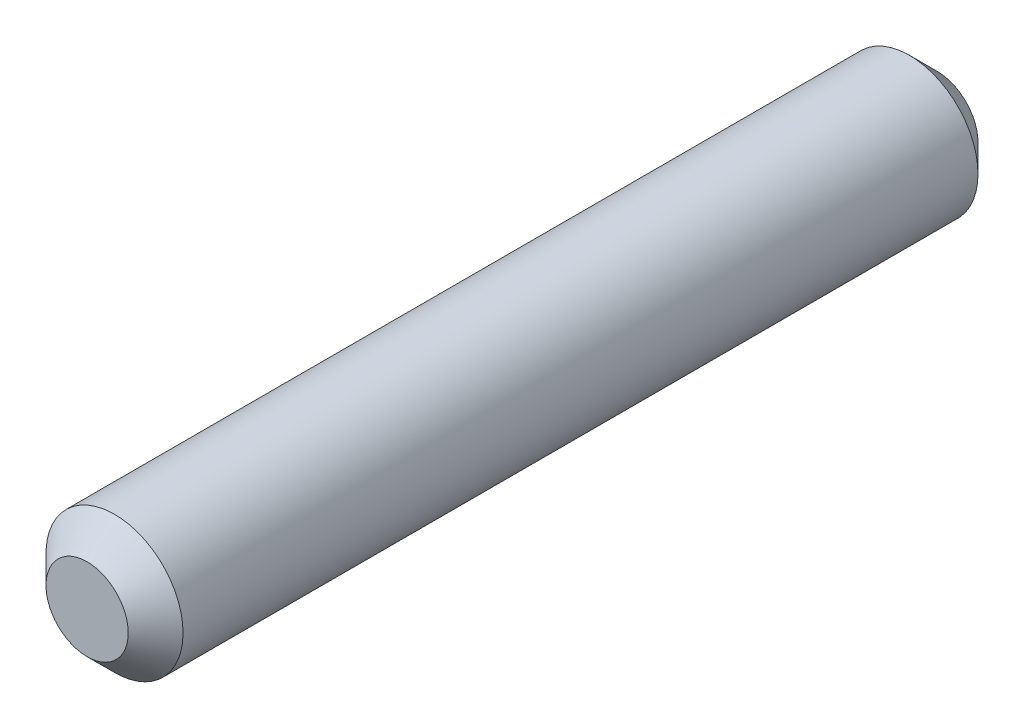
ISO-10303-21;
HEADER;
FILE_DESCRIPTION(('STEP AP214'),'2;1');
FILE_NAME('part.step','',(''),(''),'','','');
FILE_SCHEMA(('AUTOMOTIVE_DESIGN { 1 0 10303 214 1 1 1 1 }'));
ENDSEC;
DATA;
#1=APPLICATION_CONTEXT('core data for automotive mechanical design processes');
#2=APPLICATION_PROTOCOL_DEFINITION('international standard','automotive_design',2000,#1);
#3=PRODUCT_CONTEXT('',#1,'mechanical');
#4=PRODUCT('Part','Part','',(#3));
#5=PRODUCT_RELATED_PRODUCT_CATEGORY('part','',(#4));
#6=PRODUCT_DEFINITION_FORMATION('','',#4);
#7=PRODUCT_DEFINITION_CONTEXT('part definition',#1,'design');
#8=PRODUCT_DEFINITION('design','',#6,#7);
#9=PRODUCT_DEFINITION_SHAPE('','',#8);
#10=(LENGTH_UNIT() NAMED_UNIT(*) SI_UNIT(.MILLI.,.METRE.));
#11=(NAMED_UNIT(*) PLANE_ANGLE_UNIT() SI_UNIT($,.RADIAN.));
#12=(NAMED_UNIT(*) SI_UNIT($,.STERADIAN.) SOLID_ANGLE_UNIT());
#13=UNCERTAINTY_MEASURE_WITH_UNIT(LENGTH_MEASURE(1.E-05),#10,'distance_accuracy_value','');
#14=(GEOMETRIC_REPRESENTATION_CONTEXT(3) GLOBAL_UNCERTAINTY_ASSIGNED_CONTEXT((#13)) GLOBAL_UNIT_ASSIGNED_CONTEXT((#10,
#11,#12)) REPRESENTATION_CONTEXT('',''));
#15=CARTESIAN_POINT('',(0.,0.,0.));
#16=DIRECTION('',(0.,0.,1.));
#17=DIRECTION('',(1.,0.,0.));
#18=AXIS2_PLACEMENT_3D('',#15,#16,#17);
#19=CARTESIAN_POINT('',(0.,0.,31.));
#20=DIRECTION('',(0.,0.,-1.));
#21=DIRECTION('',(-1.,0.,0.));
#22=AXIS2_PLACEMENT_3D('',#19,#20,#21);
#23=CYLINDRICAL_SURFACE('',#22,5.);
#24=CARTESIAN_POINT('',(0.,0.,-29.));
#25=DIRECTION('',(0.,0.,1.));
#26=DIRECTION('',(1.,0.,0.));
#27=AXIS2_PLACEMENT_3D('',#24,#25,#26);
#28=CIRCLE('',#27,5.);
#29=CARTESIAN_POINT('',(5.,0.,-29.));
#30=VERTEX_POINT('',#29);
#31=EDGE_CURVE('E43',#30,#30,#28,.T.);
#32=ORIENTED_EDGE('',*,*,#31,.T.);
#33=EDGE_LOOP('',(#32));
#34=FACE_BOUND('',#33,.T.);
#35=CARTESIAN_POINT('',(0.,0.,29.));
#36=DIRECTION('',(0.,0.,1.));
#37=DIRECTION('',(1.,0.,0.));
#38=AXIS2_PLACEMENT_3D('',#35,#36,#37);
#39=CIRCLE('',#38,5.);
#40=CARTESIAN_POINT('',(5.,0.,29.));
#41=VERTEX_POINT('',#40);
#42=EDGE_CURVE('E47',#41,#41,#39,.F.);
#43=ORIENTED_EDGE('',*,*,#42,.T.);
#44=EDGE_LOOP('',(#43));
#45=FACE_BOUND('',#44,.T.);
#46=ADVANCED_FACE('F32',(#34,#45),#23,.T.);
#47=CARTESIAN_POINT('',(0.,0.,31.));
#48=DIRECTION('',(0.,0.,1.));
#49=DIRECTION('',(1.,0.,0.));
#50=AXIS2_PLACEMENT_3D('',#47,#48,#49);
#51=PLANE('',#50);
#52=CARTESIAN_POINT('',(0.,0.,31.));
#53=DIRECTION('',(0.,0.,1.));
#54=DIRECTION('',(1.,0.,0.));
#55=AXIS2_PLACEMENT_3D('',#52,#53,#54);
#56=CIRCLE('',#55,3.00000000000001);
#57=CARTESIAN_POINT('',(3.00000000000001,0.,31.));
#58=VERTEX_POINT('',#57);
#59=EDGE_CURVE('E10',#58,#58,#56,.T.);
#60=ORIENTED_EDGE('',*,*,#59,.T.);
#61=EDGE_LOOP('',(#60));
#62=FACE_BOUND('',#61,.T.);
#63=ADVANCED_FACE('F63',(#62),#51,.T.);
#64=CARTESIAN_POINT('',(0.,0.,-31.));
#65=DIRECTION('',(0.,0.,1.));
#66=DIRECTION('',(1.,0.,0.));
#67=AXIS2_PLACEMENT_3D('',#64,#65,#66);
#68=PLANE('',#67);
#69=CARTESIAN_POINT('',(0.,0.,-31.));
#70=DIRECTION('',(0.,0.,1.));
#71=DIRECTION('',(1.,0.,0.));
#72=AXIS2_PLACEMENT_3D('',#69,#70,#71);
#73=CIRCLE('',#72,2.99999999999998);
#74=CARTESIAN_POINT('',(2.99999999999998,0.,-31.));
#75=VERTEX_POINT('',#74);
#76=EDGE_CURVE('E39',#75,#75,#73,.F.);
#77=ORIENTED_EDGE('',*,*,#76,.T.);
#78=EDGE_LOOP('',(#77));
#79=FACE_BOUND('',#78,.T.);
#80=ADVANCED_FACE('F60',(#79),#68,.F.);
#81=CARTESIAN_POINT('',(0.,0.,-29.));
#82=DIRECTION('',(0.,0.,1.));
#83=DIRECTION('',(1.,0.,0.));
#84=AXIS2_PLACEMENT_3D('',#81,#82,#83);
#85=CONICAL_SURFACE('',#84,5.,0.785398163397451);
#86=ORIENTED_EDGE('',*,*,#76,.F.);
#87=EDGE_LOOP('',(#86));
#88=FACE_BOUND('',#87,.T.);
#89=ORIENTED_EDGE('',*,*,#31,.F.);
#90=EDGE_LOOP('',(#89));
#91=FACE_BOUND('',#90,.T.);
#92=ADVANCED_FACE('F56',(#88,#91),#85,.T.);
#93=CARTESIAN_POINT('',(0.,0.,31.));
#94=DIRECTION('',(0.,0.,-1.));
#95=DIRECTION('',(-1.,0.,0.));
#96=AXIS2_PLACEMENT_3D('',#93,#94,#95);
#97=CONICAL_SURFACE('',#96,3.00000000000001,0.785398163397444);
#98=ORIENTED_EDGE('',*,*,#42,.F.);
#99=EDGE_LOOP('',(#98));
#100=FACE_BOUND('',#99,.T.);
#101=ORIENTED_EDGE('',*,*,#59,.F.);
#102=EDGE_LOOP('',(#101));
#103=FACE_BOUND('',#102,.T.);
#104=ADVANCED_FACE('F34',(#100,#103),#97,.T.);
#105=CLOSED_SHELL('',(#46,#63,#80,#92,#104));
#106=MANIFOLD_SOLID_BREP('B2',#105);
#107=ADVANCED_BREP_SHAPE_REPRESENTATION('',(#18,#106),#14);
#108=SHAPE_DEFINITION_REPRESENTATION(#9,#107);
ENDSEC;
END-ISO-10303-21;
